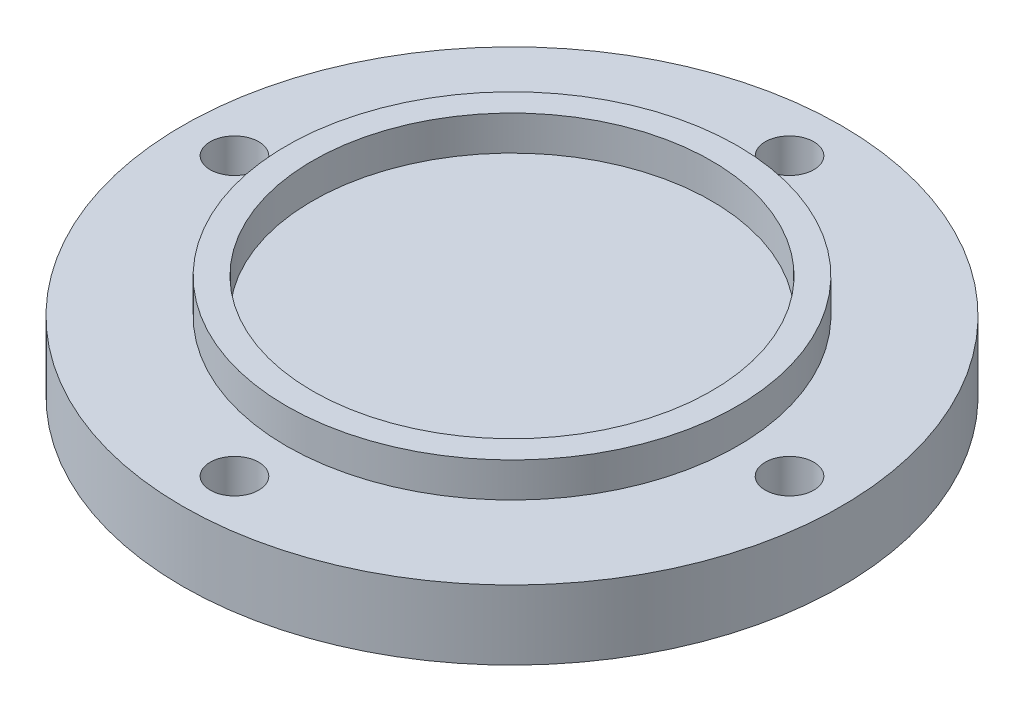
ISO-10303-21;
HEADER;
FILE_DESCRIPTION(('STEP AP214'),'2;1');
FILE_NAME('part.step','',(''),(''),'','','');
FILE_SCHEMA(('AUTOMOTIVE_DESIGN { 1 0 10303 214 1 1 1 1 }'));
ENDSEC;
DATA;
#1=APPLICATION_CONTEXT('core data for automotive mechanical design processes');
#2=APPLICATION_PROTOCOL_DEFINITION('international standard','automotive_design',2000,#1);
#3=PRODUCT_CONTEXT('',#1,'mechanical');
#4=PRODUCT('Part','Part','',(#3));
#5=PRODUCT_RELATED_PRODUCT_CATEGORY('part','',(#4));
#6=PRODUCT_DEFINITION_FORMATION('','',#4);
#7=PRODUCT_DEFINITION_CONTEXT('part definition',#1,'design');
#8=PRODUCT_DEFINITION('design','',#6,#7);
#9=PRODUCT_DEFINITION_SHAPE('','',#8);
#10=(LENGTH_UNIT() NAMED_UNIT(*) SI_UNIT(.MILLI.,.METRE.));
#11=(NAMED_UNIT(*) PLANE_ANGLE_UNIT() SI_UNIT($,.RADIAN.));
#12=(NAMED_UNIT(*) SI_UNIT($,.STERADIAN.) SOLID_ANGLE_UNIT());
#13=UNCERTAINTY_MEASURE_WITH_UNIT(LENGTH_MEASURE(1.E-05),#10,'distance_accuracy_value','');
#14=(GEOMETRIC_REPRESENTATION_CONTEXT(3) GLOBAL_UNCERTAINTY_ASSIGNED_CONTEXT((#13)) GLOBAL_UNIT_ASSIGNED_CONTEXT((#10,
#11,#12)) REPRESENTATION_CONTEXT('',''));
#15=CARTESIAN_POINT('',(0.,0.,0.));
#16=DIRECTION('',(0.,0.,1.));
#17=DIRECTION('',(1.,0.,0.));
#18=AXIS2_PLACEMENT_3D('',#15,#16,#17);
#19=CARTESIAN_POINT('',(0.,10.,0.));
#20=DIRECTION('',(0.,-1.,0.));
#21=DIRECTION('',(0.,0.,-1.));
#22=AXIS2_PLACEMENT_3D('',#19,#20,#21);
#23=CYLINDRICAL_SURFACE('',#22,95.);
#24=CARTESIAN_POINT('',(0.,10.,0.));
#25=DIRECTION('',(0.,1.,0.));
#26=DIRECTION('',(0.,0.,1.));
#27=AXIS2_PLACEMENT_3D('',#24,#25,#26);
#28=CIRCLE('',#27,95.);
#29=CARTESIAN_POINT('',(0.,10.,95.));
#30=VERTEX_POINT('',#29);
#31=EDGE_CURVE('E45',#30,#30,#28,.T.);
#32=ORIENTED_EDGE('',*,*,#31,.F.);
#33=EDGE_LOOP('',(#32));
#34=FACE_BOUND('',#33,.T.);
#35=CARTESIAN_POINT('',(0.,-10.,0.));
#36=DIRECTION('',(0.,1.,0.));
#37=DIRECTION('',(0.,0.,1.));
#38=AXIS2_PLACEMENT_3D('',#35,#36,#37);
#39=CIRCLE('',#38,95.);
#40=CARTESIAN_POINT('',(0.,-10.,95.));
#41=VERTEX_POINT('',#40);
#42=EDGE_CURVE('E40',#41,#41,#39,.T.);
#43=ORIENTED_EDGE('',*,*,#42,.T.);
#44=EDGE_LOOP('',(#43));
#45=FACE_BOUND('',#44,.T.);
#46=ADVANCED_FACE('F37',(#34,#45),#23,.T.);
#47=CARTESIAN_POINT('',(0.,10.,0.));
#48=DIRECTION('',(0.,1.,0.));
#49=DIRECTION('',(0.,0.,1.));
#50=AXIS2_PLACEMENT_3D('',#47,#48,#49);
#51=PLANE('',#50);
#52=CARTESIAN_POINT('',(0.,10.,-80.));
#53=DIRECTION('',(0.,1.,0.));
#54=DIRECTION('',(0.,0.,1.));
#55=AXIS2_PLACEMENT_3D('',#52,#53,#54);
#56=CIRCLE('',#55,7.);
#57=CARTESIAN_POINT('',(0.,10.,-73.));
#58=VERTEX_POINT('',#57);
#59=EDGE_CURVE('E89',#58,#58,#56,.T.);
#60=ORIENTED_EDGE('',*,*,#59,.F.);
#61=EDGE_LOOP('',(#60));
#62=FACE_BOUND('',#61,.T.);
#63=CARTESIAN_POINT('',(80.0000000000023,10.,-2.26393958003914E-12));
#64=DIRECTION('',(0.,1.,0.));
#65=DIRECTION('',(0.,0.,1.));
#66=AXIS2_PLACEMENT_3D('',#63,#64,#65);
#67=CIRCLE('',#66,7.00000000000177);
#68=CARTESIAN_POINT('',(80.0000000000023,10.,6.99999999999951));
#69=VERTEX_POINT('',#68);
#70=EDGE_CURVE('E81',#69,#69,#67,.T.);
#71=ORIENTED_EDGE('',*,*,#70,.F.);
#72=EDGE_LOOP('',(#71));
#73=FACE_BOUND('',#72,.T.);
#74=CARTESIAN_POINT('',(4.52787916007828E-12,10.,80.));
#75=DIRECTION('',(0.,1.,0.));
#76=DIRECTION('',(0.,0.,1.));
#77=AXIS2_PLACEMENT_3D('',#74,#75,#76);
#78=CIRCLE('',#77,7.00000000000487);
#79=CARTESIAN_POINT('',(4.52787916007828E-12,10.,87.0000000000049));
#80=VERTEX_POINT('',#79);
#81=EDGE_CURVE('E73',#80,#80,#78,.T.);
#82=ORIENTED_EDGE('',*,*,#81,.F.);
#83=EDGE_LOOP('',(#82));
#84=FACE_BOUND('',#83,.T.);
#85=CARTESIAN_POINT('',(-79.9999999999977,10.,2.27373675443232E-12));
#86=DIRECTION('',(0.,1.,0.));
#87=DIRECTION('',(0.,0.,1.));
#88=AXIS2_PLACEMENT_3D('',#85,#86,#87);
#89=CIRCLE('',#88,7.00000000000364);
#90=CARTESIAN_POINT('',(-79.9999999999977,10.,7.00000000000591));
#91=VERTEX_POINT('',#90);
#92=EDGE_CURVE('E65',#91,#91,#89,.T.);
#93=ORIENTED_EDGE('',*,*,#92,.F.);
#94=EDGE_LOOP('',(#93));
#95=FACE_BOUND('',#94,.T.);
#96=CARTESIAN_POINT('',(0.,10.,0.));
#97=DIRECTION('',(0.,1.,0.));
#98=DIRECTION('',(0.,0.,1.));
#99=AXIS2_PLACEMENT_3D('',#96,#97,#98);
#100=CIRCLE('',#99,65.);
#101=CARTESIAN_POINT('',(0.,10.,65.));
#102=VERTEX_POINT('',#101);
#103=EDGE_CURVE('E10',#102,#102,#100,.T.);
#104=ORIENTED_EDGE('',*,*,#103,.F.);
#105=EDGE_LOOP('',(#104));
#106=FACE_BOUND('',#105,.T.);
#107=ORIENTED_EDGE('',*,*,#31,.T.);
#108=EDGE_LOOP('',(#107));
#109=FACE_BOUND('',#108,.T.);
#110=ADVANCED_FACE('F107',(#62,#73,#84,#95,#106,#109),#51,.T.);
#111=CARTESIAN_POINT('',(0.,-10.,0.));
#112=DIRECTION('',(0.,1.,0.));
#113=DIRECTION('',(0.,0.,1.));
#114=AXIS2_PLACEMENT_3D('',#111,#112,#113);
#115=PLANE('',#114);
#116=CARTESIAN_POINT('',(0.,-10.,-80.));
#117=DIRECTION('',(0.,1.,0.));
#118=DIRECTION('',(0.,0.,1.));
#119=AXIS2_PLACEMENT_3D('',#116,#117,#118);
#120=CIRCLE('',#119,7.);
#121=CARTESIAN_POINT('',(0.,-10.,-73.));
#122=VERTEX_POINT('',#121);
#123=EDGE_CURVE('E61',#122,#122,#120,.T.);
#124=ORIENTED_EDGE('',*,*,#123,.T.);
#125=EDGE_LOOP('',(#124));
#126=FACE_BOUND('',#125,.T.);
#127=CARTESIAN_POINT('',(80.0000000000023,-10.,-2.26393958003914E-12));
#128=DIRECTION('',(0.,1.,0.));
#129=DIRECTION('',(0.,0.,1.));
#130=AXIS2_PLACEMENT_3D('',#127,#128,#129);
#131=CIRCLE('',#130,7.00000000000177);
#132=CARTESIAN_POINT('',(80.0000000000023,-10.,6.99999999999951));
#133=VERTEX_POINT('',#132);
#134=EDGE_CURVE('E85',#133,#133,#131,.T.);
#135=ORIENTED_EDGE('',*,*,#134,.T.);
#136=EDGE_LOOP('',(#135));
#137=FACE_BOUND('',#136,.T.);
#138=CARTESIAN_POINT('',(4.52787916007828E-12,-10.,80.));
#139=DIRECTION('',(0.,1.,0.));
#140=DIRECTION('',(0.,0.,1.));
#141=AXIS2_PLACEMENT_3D('',#138,#139,#140);
#142=CIRCLE('',#141,7.00000000000487);
#143=CARTESIAN_POINT('',(4.52787916007828E-12,-10.,87.0000000000049));
#144=VERTEX_POINT('',#143);
#145=EDGE_CURVE('E77',#144,#144,#142,.T.);
#146=ORIENTED_EDGE('',*,*,#145,.T.);
#147=EDGE_LOOP('',(#146));
#148=FACE_BOUND('',#147,.T.);
#149=CARTESIAN_POINT('',(-79.9999999999977,-10.,2.27373675443232E-12));
#150=DIRECTION('',(0.,1.,0.));
#151=DIRECTION('',(0.,0.,1.));
#152=AXIS2_PLACEMENT_3D('',#149,#150,#151);
#153=CIRCLE('',#152,7.00000000000364);
#154=CARTESIAN_POINT('',(-79.9999999999977,-10.,7.00000000000591));
#155=VERTEX_POINT('',#154);
#156=EDGE_CURVE('E69',#155,#155,#153,.T.);
#157=ORIENTED_EDGE('',*,*,#156,.T.);
#158=EDGE_LOOP('',(#157));
#159=FACE_BOUND('',#158,.T.);
#160=ORIENTED_EDGE('',*,*,#42,.F.);
#161=EDGE_LOOP('',(#160));
#162=FACE_BOUND('',#161,.T.);
#163=ADVANCED_FACE('F97',(#126,#137,#148,#159,#162),#115,.F.);
#164=CARTESIAN_POINT('',(0.,20.,0.));
#165=DIRECTION('',(0.,-1.,0.));
#166=DIRECTION('',(0.,0.,-1.));
#167=AXIS2_PLACEMENT_3D('',#164,#165,#166);
#168=CYLINDRICAL_SURFACE('',#167,65.);
#169=CARTESIAN_POINT('',(0.,20.,0.));
#170=DIRECTION('',(0.,1.,0.));
#171=DIRECTION('',(0.,0.,1.));
#172=AXIS2_PLACEMENT_3D('',#169,#170,#171);
#173=CIRCLE('',#172,65.);
#174=CARTESIAN_POINT('',(0.,20.,65.));
#175=VERTEX_POINT('',#174);
#176=EDGE_CURVE('E52',#175,#175,#173,.T.);
#177=ORIENTED_EDGE('',*,*,#176,.F.);
#178=EDGE_LOOP('',(#177));
#179=FACE_BOUND('',#178,.T.);
#180=ORIENTED_EDGE('',*,*,#103,.T.);
#181=EDGE_LOOP('',(#180));
#182=FACE_BOUND('',#181,.T.);
#183=ADVANCED_FACE('F127',(#179,#182),#168,.T.);
#184=CARTESIAN_POINT('',(0.,20.,0.));
#185=DIRECTION('',(0.,1.,0.));
#186=DIRECTION('',(0.,0.,1.));
#187=AXIS2_PLACEMENT_3D('',#184,#185,#186);
#188=PLANE('',#187);
#189=CARTESIAN_POINT('',(0.,20.,0.));
#190=DIRECTION('',(0.,1.,0.));
#191=DIRECTION('',(0.,0.,1.));
#192=AXIS2_PLACEMENT_3D('',#189,#190,#191);
#193=CIRCLE('',#192,57.5);
#194=CARTESIAN_POINT('',(0.,20.,57.5));
#195=VERTEX_POINT('',#194);
#196=EDGE_CURVE('E57',#195,#195,#193,.T.);
#197=ORIENTED_EDGE('',*,*,#196,.F.);
#198=EDGE_LOOP('',(#197));
#199=FACE_BOUND('',#198,.T.);
#200=ORIENTED_EDGE('',*,*,#176,.T.);
#201=EDGE_LOOP('',(#200));
#202=FACE_BOUND('',#201,.T.);
#203=ADVANCED_FACE('F131',(#199,#202),#188,.T.);
#204=CARTESIAN_POINT('',(0.,10.,0.));
#205=DIRECTION('',(0.,1.,0.));
#206=DIRECTION('',(0.,0.,1.));
#207=AXIS2_PLACEMENT_3D('',#204,#205,#206);
#208=CYLINDRICAL_SURFACE('',#207,57.5);
#209=CARTESIAN_POINT('',(0.,10.,0.));
#210=DIRECTION('',(0.,1.,0.));
#211=DIRECTION('',(0.,0.,1.));
#212=AXIS2_PLACEMENT_3D('',#209,#210,#211);
#213=CIRCLE('',#212,57.5);
#214=CARTESIAN_POINT('',(0.,10.,57.5));
#215=VERTEX_POINT('',#214);
#216=EDGE_CURVE('E56',#215,#215,#213,.T.);
#217=ORIENTED_EDGE('',*,*,#216,.F.);
#218=EDGE_LOOP('',(#217));
#219=FACE_BOUND('',#218,.T.);
#220=ORIENTED_EDGE('',*,*,#196,.T.);
#221=EDGE_LOOP('',(#220));
#222=FACE_BOUND('',#221,.T.);
#223=ADVANCED_FACE('F137',(#219,#222),#208,.F.);
#224=CARTESIAN_POINT('',(0.,10.,0.));
#225=DIRECTION('',(0.,1.,0.));
#226=DIRECTION('',(0.,0.,1.));
#227=AXIS2_PLACEMENT_3D('',#224,#225,#226);
#228=PLANE('',#227);
#229=ORIENTED_EDGE('',*,*,#216,.T.);
#230=EDGE_LOOP('',(#229));
#231=FACE_BOUND('',#230,.T.);
#232=ADVANCED_FACE('F141',(#231),#228,.T.);
#233=CARTESIAN_POINT('',(-79.9999999999977,-10.,2.27373675443232E-12));
#234=DIRECTION('',(0.,1.,0.));
#235=DIRECTION('',(0.,0.,1.));
#236=AXIS2_PLACEMENT_3D('',#233,#234,#235);
#237=CYLINDRICAL_SURFACE('',#236,7.00000000000364);
#238=ORIENTED_EDGE('',*,*,#156,.F.);
#239=EDGE_LOOP('',(#238));
#240=FACE_BOUND('',#239,.T.);
#241=ORIENTED_EDGE('',*,*,#92,.T.);
#242=EDGE_LOOP('',(#241));
#243=FACE_BOUND('',#242,.T.);
#244=ADVANCED_FACE('F145',(#240,#243),#237,.F.);
#245=CARTESIAN_POINT('',(4.52787916007828E-12,-10.,80.));
#246=DIRECTION('',(0.,1.,0.));
#247=DIRECTION('',(0.,0.,1.));
#248=AXIS2_PLACEMENT_3D('',#245,#246,#247);
#249=CYLINDRICAL_SURFACE('',#248,7.00000000000487);
#250=ORIENTED_EDGE('',*,*,#145,.F.);
#251=EDGE_LOOP('',(#250));
#252=FACE_BOUND('',#251,.T.);
#253=ORIENTED_EDGE('',*,*,#81,.T.);
#254=EDGE_LOOP('',(#253));
#255=FACE_BOUND('',#254,.T.);
#256=ADVANCED_FACE('F149',(#252,#255),#249,.F.);
#257=CARTESIAN_POINT('',(80.0000000000023,-10.,-2.26393958003914E-12));
#258=DIRECTION('',(0.,1.,0.));
#259=DIRECTION('',(0.,0.,1.));
#260=AXIS2_PLACEMENT_3D('',#257,#258,#259);
#261=CYLINDRICAL_SURFACE('',#260,7.00000000000177);
#262=ORIENTED_EDGE('',*,*,#134,.F.);
#263=EDGE_LOOP('',(#262));
#264=FACE_BOUND('',#263,.T.);
#265=ORIENTED_EDGE('',*,*,#70,.T.);
#266=EDGE_LOOP('',(#265));
#267=FACE_BOUND('',#266,.T.);
#268=ADVANCED_FACE('F103',(#264,#267),#261,.F.);
#269=CARTESIAN_POINT('',(0.,-10.,-80.));
#270=DIRECTION('',(0.,1.,0.));
#271=DIRECTION('',(0.,0.,1.));
#272=AXIS2_PLACEMENT_3D('',#269,#270,#271);
#273=CYLINDRICAL_SURFACE('',#272,7.);
#274=ORIENTED_EDGE('',*,*,#123,.F.);
#275=EDGE_LOOP('',(#274));
#276=FACE_BOUND('',#275,.T.);
#277=ORIENTED_EDGE('',*,*,#59,.T.);
#278=EDGE_LOOP('',(#277));
#279=FACE_BOUND('',#278,.T.);
#280=ADVANCED_FACE('F100',(#276,#279),#273,.F.);
#281=CLOSED_SHELL('',(#46,#110,#163,#183,#203,#223,#232,#244,#256,#268,#280));
#282=MANIFOLD_SOLID_BREP('B2',#281);
#283=ADVANCED_BREP_SHAPE_REPRESENTATION('',(#18,#282),#14);
#284=SHAPE_DEFINITION_REPRESENTATION(#9,#283);
ENDSEC;
END-ISO-10303-21;
